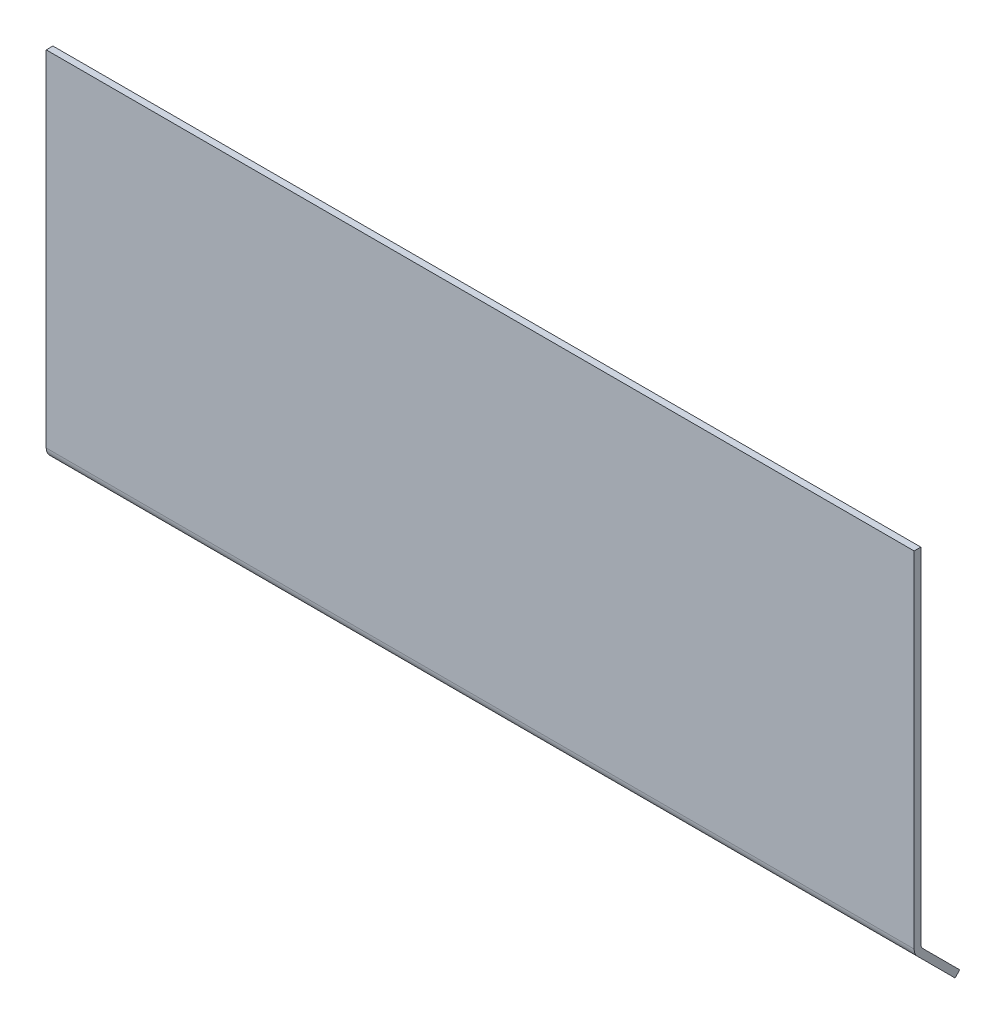
ISO-10303-21;
HEADER;
FILE_DESCRIPTION(('STEP AP214'),'2;1');
FILE_NAME('part.step','',(''),(''),'','','');
FILE_SCHEMA(('AUTOMOTIVE_DESIGN { 1 0 10303 214 1 1 1 1 }'));
ENDSEC;
DATA;
#1=APPLICATION_CONTEXT('core data for automotive mechanical design processes');
#2=APPLICATION_PROTOCOL_DEFINITION('international standard','automotive_design',2000,#1);
#3=PRODUCT_CONTEXT('',#1,'mechanical');
#4=PRODUCT('Part','Part','',(#3));
#5=PRODUCT_RELATED_PRODUCT_CATEGORY('part','',(#4));
#6=PRODUCT_DEFINITION_FORMATION('','',#4);
#7=PRODUCT_DEFINITION_CONTEXT('part definition',#1,'design');
#8=PRODUCT_DEFINITION('design','',#6,#7);
#9=PRODUCT_DEFINITION_SHAPE('','',#8);
#10=(LENGTH_UNIT() NAMED_UNIT(*) SI_UNIT(.MILLI.,.METRE.));
#11=(NAMED_UNIT(*) PLANE_ANGLE_UNIT() SI_UNIT($,.RADIAN.));
#12=(NAMED_UNIT(*) SI_UNIT($,.STERADIAN.) SOLID_ANGLE_UNIT());
#13=UNCERTAINTY_MEASURE_WITH_UNIT(LENGTH_MEASURE(1.E-05),#10,'distance_accuracy_value','');
#14=(GEOMETRIC_REPRESENTATION_CONTEXT(3) GLOBAL_UNCERTAINTY_ASSIGNED_CONTEXT((#13)) GLOBAL_UNIT_ASSIGNED_CONTEXT((#10,
#11,#12)) REPRESENTATION_CONTEXT('',''));
#15=CARTESIAN_POINT('',(0.,0.,0.));
#16=DIRECTION('',(0.,0.,1.));
#17=DIRECTION('',(1.,0.,0.));
#18=AXIS2_PLACEMENT_3D('',#15,#16,#17);
#19=CARTESIAN_POINT('',(360.,-143.211474761492,-110.4));
#20=DIRECTION('',(-1.,0.,0.));
#21=DIRECTION('',(0.,0.,1.));
#22=AXIS2_PLACEMENT_3D('',#19,#20,#21);
#23=PLANE('',#22);
#24=DIRECTION('',(0.,-1.,0.));
#25=VECTOR('',#24,1.);
#26=CARTESIAN_POINT('',(360.,-143.211474761492,-107.4));
#27=LINE('',#26,#25);
#28=CARTESIAN_POINT('',(360.,-143.211474761492,-107.4));
#29=VERTEX_POINT('',#28);
#30=CARTESIAN_POINT('',(360.,-298.140713314432,-107.4));
#31=VERTEX_POINT('',#30);
#32=EDGE_CURVE('E137',#29,#31,#27,.T.);
#33=ORIENTED_EDGE('',*,*,#32,.T.);
#34=CARTESIAN_POINT('',(360.,-298.140713314432,-112.4));
#35=DIRECTION('',(-1.,0.,0.));
#36=DIRECTION('',(0.,0.,1.));
#37=AXIS2_PLACEMENT_3D('',#34,#35,#36);
#38=CIRCLE('',#37,5.);
#39=CARTESIAN_POINT('',(360.,-301.676247220365,-108.864466094067));
#40=VERTEX_POINT('',#39);
#41=EDGE_CURVE('E176',#31,#40,#38,.F.);
#42=ORIENTED_EDGE('',*,*,#41,.T.);
#43=DIRECTION('',(0.,-0.707106781186552,-0.707106781186543));
#44=VECTOR('',#43,1.);
#45=CARTESIAN_POINT('',(360.,-300.211781126298,-107.4));
#46=LINE('',#45,#44);
#47=CARTESIAN_POINT('',(360.,-318.593187218806,-125.781406092508));
#48=VERTEX_POINT('',#47);
#49=EDGE_CURVE('E138',#40,#48,#46,.T.);
#50=ORIENTED_EDGE('',*,*,#49,.T.);
#51=DIRECTION('',(0.,0.707106781186538,-0.707106781186557));
#52=VECTOR('',#51,1.);
#53=CARTESIAN_POINT('',(360.,-318.593187218806,-125.781406092508));
#54=LINE('',#53,#52);
#55=CARTESIAN_POINT('',(360.,-316.471866875247,-127.902726436068));
#56=VERTEX_POINT('',#55);
#57=EDGE_CURVE('E133',#48,#56,#54,.T.);
#58=ORIENTED_EDGE('',*,*,#57,.T.);
#59=DIRECTION('',(0.,0.707106781186551,0.707106781186544));
#60=VECTOR('',#59,1.);
#61=CARTESIAN_POINT('',(360.,-316.471866875247,-127.902726436068));
#62=LINE('',#61,#60);
#63=CARTESIAN_POINT('',(360.,-299.847820095619,-111.27867965644));
#64=VERTEX_POINT('',#63);
#65=EDGE_CURVE('E116',#56,#64,#62,.T.);
#66=ORIENTED_EDGE('',*,*,#65,.T.);
#67=CARTESIAN_POINT('',(360.,-297.726499752059,-113.4));
#68=DIRECTION('',(-1.,0.,0.));
#69=DIRECTION('',(0.,0.,1.));
#70=AXIS2_PLACEMENT_3D('',#67,#68,#69);
#71=CIRCLE('',#70,3.);
#72=CARTESIAN_POINT('',(360.,-297.726499752059,-110.4));
#73=VERTEX_POINT('',#72);
#74=EDGE_CURVE('E11',#64,#73,#71,.T.);
#75=ORIENTED_EDGE('',*,*,#74,.T.);
#76=DIRECTION('',(0.,-1.,0.));
#77=VECTOR('',#76,1.);
#78=CARTESIAN_POINT('',(360.,-143.211474761492,-110.4));
#79=LINE('',#78,#77);
#80=CARTESIAN_POINT('',(360.,-143.211474761492,-110.4));
#81=VERTEX_POINT('',#80);
#82=EDGE_CURVE('E139',#81,#73,#79,.T.);
#83=ORIENTED_EDGE('',*,*,#82,.F.);
#84=DIRECTION('',(0.,0.,1.));
#85=VECTOR('',#84,1.);
#86=CARTESIAN_POINT('',(360.,-143.211474761492,-110.4));
#87=LINE('',#86,#85);
#88=EDGE_CURVE('E150',#81,#29,#87,.T.);
#89=ORIENTED_EDGE('',*,*,#88,.T.);
#90=EDGE_LOOP('',(#33,#42,#50,#58,#66,#75,#83,#89));
#91=FACE_BOUND('',#90,.T.);
#92=ADVANCED_FACE('F41',(#91),#23,.F.);
#93=CARTESIAN_POINT('',(-30.,-143.211474761492,-110.4));
#94=DIRECTION('',(1.,0.,0.));
#95=DIRECTION('',(0.,1.,0.));
#96=AXIS2_PLACEMENT_3D('',#93,#94,#95);
#97=PLANE('',#96);
#98=DIRECTION('',(0.,0.707106781186552,0.707106781186543));
#99=VECTOR('',#98,1.);
#100=CARTESIAN_POINT('',(-30.,-300.211781126298,-107.4));
#101=LINE('',#100,#99);
#102=CARTESIAN_POINT('',(-30.,-318.593187218806,-125.781406092508));
#103=VERTEX_POINT('',#102);
#104=CARTESIAN_POINT('',(-30.,-301.676247220365,-108.864466094067));
#105=VERTEX_POINT('',#104);
#106=EDGE_CURVE('E121',#103,#105,#101,.T.);
#107=ORIENTED_EDGE('',*,*,#106,.T.);
#108=CARTESIAN_POINT('',(-30.,-298.140713314432,-112.4));
#109=DIRECTION('',(1.,0.,0.));
#110=DIRECTION('',(0.,1.,0.));
#111=AXIS2_PLACEMENT_3D('',#108,#109,#110);
#112=CIRCLE('',#111,5.);
#113=CARTESIAN_POINT('',(-30.,-298.140713314432,-107.4));
#114=VERTEX_POINT('',#113);
#115=EDGE_CURVE('E170',#105,#114,#112,.F.);
#116=ORIENTED_EDGE('',*,*,#115,.T.);
#117=DIRECTION('',(0.,1.,0.));
#118=VECTOR('',#117,1.);
#119=CARTESIAN_POINT('',(-30.,-143.211474761492,-107.4));
#120=LINE('',#119,#118);
#121=CARTESIAN_POINT('',(-30.,-143.211474761492,-107.4));
#122=VERTEX_POINT('',#121);
#123=EDGE_CURVE('E154',#114,#122,#120,.T.);
#124=ORIENTED_EDGE('',*,*,#123,.T.);
#125=DIRECTION('',(0.,0.,1.));
#126=VECTOR('',#125,1.);
#127=CARTESIAN_POINT('',(-30.,-143.211474761492,-110.4));
#128=LINE('',#127,#126);
#129=CARTESIAN_POINT('',(-30.,-143.211474761492,-110.4));
#130=VERTEX_POINT('',#129);
#131=EDGE_CURVE('E162',#130,#122,#128,.T.);
#132=ORIENTED_EDGE('',*,*,#131,.F.);
#133=DIRECTION('',(0.,1.,0.));
#134=VECTOR('',#133,1.);
#135=CARTESIAN_POINT('',(-30.,-143.211474761492,-110.4));
#136=LINE('',#135,#134);
#137=CARTESIAN_POINT('',(-30.,-297.726499752059,-110.4));
#138=VERTEX_POINT('',#137);
#139=EDGE_CURVE('E143',#138,#130,#136,.T.);
#140=ORIENTED_EDGE('',*,*,#139,.F.);
#141=CARTESIAN_POINT('',(-30.,-297.726499752059,-113.4));
#142=DIRECTION('',(1.,0.,0.));
#143=DIRECTION('',(0.,1.,0.));
#144=AXIS2_PLACEMENT_3D('',#141,#142,#143);
#145=CIRCLE('',#144,3.);
#146=CARTESIAN_POINT('',(-30.,-299.847820095619,-111.27867965644));
#147=VERTEX_POINT('',#146);
#148=EDGE_CURVE('E50',#138,#147,#145,.T.);
#149=ORIENTED_EDGE('',*,*,#148,.T.);
#150=DIRECTION('',(0.,-0.707106781186551,-0.707106781186544));
#151=VECTOR('',#150,1.);
#152=CARTESIAN_POINT('',(-30.,-316.471866875247,-127.902726436068));
#153=LINE('',#152,#151);
#154=CARTESIAN_POINT('',(-30.,-316.471866875247,-127.902726436068));
#155=VERTEX_POINT('',#154);
#156=EDGE_CURVE('E104',#147,#155,#153,.T.);
#157=ORIENTED_EDGE('',*,*,#156,.T.);
#158=DIRECTION('',(0.,-0.707106781186538,0.707106781186557));
#159=VECTOR('',#158,1.);
#160=CARTESIAN_POINT('',(-30.,-318.593187218806,-125.781406092508));
#161=LINE('',#160,#159);
#162=EDGE_CURVE('E109',#155,#103,#161,.T.);
#163=ORIENTED_EDGE('',*,*,#162,.T.);
#164=EDGE_LOOP('',(#107,#116,#124,#132,#140,#149,#157,#163));
#165=FACE_BOUND('',#164,.T.);
#166=ADVANCED_FACE('F107',(#165),#97,.F.);
#167=CARTESIAN_POINT('',(360.,-143.211474761492,-110.4));
#168=DIRECTION('',(0.,-1.,0.));
#169=DIRECTION('',(0.,0.,-1.));
#170=AXIS2_PLACEMENT_3D('',#167,#168,#169);
#171=PLANE('',#170);
#172=DIRECTION('',(1.,0.,0.));
#173=VECTOR('',#172,1.);
#174=CARTESIAN_POINT('',(360.,-143.211474761492,-107.4));
#175=LINE('',#174,#173);
#176=EDGE_CURVE('E144',#122,#29,#175,.T.);
#177=ORIENTED_EDGE('',*,*,#176,.T.);
#178=ORIENTED_EDGE('',*,*,#88,.F.);
#179=DIRECTION('',(1.,0.,0.));
#180=VECTOR('',#179,1.);
#181=CARTESIAN_POINT('',(360.,-143.211474761492,-110.4));
#182=LINE('',#181,#180);
#183=EDGE_CURVE('E147',#130,#81,#182,.T.);
#184=ORIENTED_EDGE('',*,*,#183,.F.);
#185=ORIENTED_EDGE('',*,*,#131,.T.);
#186=EDGE_LOOP('',(#177,#178,#184,#185));
#187=FACE_BOUND('',#186,.T.);
#188=ADVANCED_FACE('F230',(#187),#171,.F.);
#189=CARTESIAN_POINT('',(0.,0.,-110.4));
#190=DIRECTION('',(0.,0.,-1.));
#191=DIRECTION('',(0.,1.,0.));
#192=AXIS2_PLACEMENT_3D('',#189,#190,#191);
#193=PLANE('',#192);
#194=ORIENTED_EDGE('',*,*,#82,.T.);
#195=DIRECTION('',(-1.,0.,0.));
#196=VECTOR('',#195,1.);
#197=CARTESIAN_POINT('',(-30.,-297.726499752059,-110.4));
#198=LINE('',#197,#196);
#199=EDGE_CURVE('E179',#73,#138,#198,.T.);
#200=ORIENTED_EDGE('',*,*,#199,.T.);
#201=ORIENTED_EDGE('',*,*,#139,.T.);
#202=ORIENTED_EDGE('',*,*,#183,.T.);
#203=EDGE_LOOP('',(#194,#200,#201,#202));
#204=FACE_BOUND('',#203,.T.);
#205=ADVANCED_FACE('F232',(#204),#193,.T.);
#206=CARTESIAN_POINT('',(0.,0.,-107.4));
#207=DIRECTION('',(0.,0.,-1.));
#208=DIRECTION('',(0.,1.,0.));
#209=AXIS2_PLACEMENT_3D('',#206,#207,#208);
#210=PLANE('',#209);
#211=ORIENTED_EDGE('',*,*,#123,.F.);
#212=DIRECTION('',(-1.,0.,0.));
#213=VECTOR('',#212,1.);
#214=CARTESIAN_POINT('',(360.,-298.140713314432,-107.4));
#215=LINE('',#214,#213);
#216=EDGE_CURVE('E173',#114,#31,#215,.F.);
#217=ORIENTED_EDGE('',*,*,#216,.T.);
#218=ORIENTED_EDGE('',*,*,#32,.F.);
#219=ORIENTED_EDGE('',*,*,#176,.F.);
#220=EDGE_LOOP('',(#211,#217,#218,#219));
#221=FACE_BOUND('',#220,.T.);
#222=ADVANCED_FACE('F222',(#221),#210,.F.);
#223=CARTESIAN_POINT('',(388.380715341958,-300.211781126298,-107.4));
#224=DIRECTION('',(0.,-0.707106781186543,0.707106781186552));
#225=DIRECTION('',(0.,-0.707106781186552,-0.707106781186543));
#226=AXIS2_PLACEMENT_3D('',#223,#224,#225);
#227=PLANE('',#226);
#228=ORIENTED_EDGE('',*,*,#49,.F.);
#229=DIRECTION('',(-1.,0.,0.));
#230=VECTOR('',#229,1.);
#231=CARTESIAN_POINT('',(-30.,-301.676247220365,-108.864466094067));
#232=LINE('',#231,#230);
#233=EDGE_CURVE('E166',#40,#105,#232,.T.);
#234=ORIENTED_EDGE('',*,*,#233,.T.);
#235=ORIENTED_EDGE('',*,*,#106,.F.);
#236=DIRECTION('',(-1.,0.,0.));
#237=VECTOR('',#236,1.);
#238=CARTESIAN_POINT('',(388.380715341958,-318.593187218806,-125.781406092508));
#239=LINE('',#238,#237);
#240=EDGE_CURVE('E120',#48,#103,#239,.T.);
#241=ORIENTED_EDGE('',*,*,#240,.F.);
#242=EDGE_LOOP('',(#228,#234,#235,#241));
#243=FACE_BOUND('',#242,.T.);
#244=ADVANCED_FACE('F214',(#243),#227,.T.);
#245=CARTESIAN_POINT('',(388.380715341958,-318.593187218806,-125.781406092508));
#246=DIRECTION('',(0.,-0.707106781186557,-0.707106781186538));
#247=DIRECTION('',(0.,0.707106781186538,-0.707106781186557));
#248=AXIS2_PLACEMENT_3D('',#245,#246,#247);
#249=PLANE('',#248);
#250=ORIENTED_EDGE('',*,*,#57,.F.);
#251=ORIENTED_EDGE('',*,*,#240,.T.);
#252=ORIENTED_EDGE('',*,*,#162,.F.);
#253=DIRECTION('',(-1.,0.,0.));
#254=VECTOR('',#253,1.);
#255=CARTESIAN_POINT('',(388.380715341958,-316.471866875247,-127.902726436068));
#256=LINE('',#255,#254);
#257=EDGE_CURVE('E114',#56,#155,#256,.T.);
#258=ORIENTED_EDGE('',*,*,#257,.F.);
#259=EDGE_LOOP('',(#250,#251,#252,#258));
#260=FACE_BOUND('',#259,.T.);
#261=ADVANCED_FACE('F123',(#260),#249,.T.);
#262=CARTESIAN_POINT('',(388.380715341958,-316.471866875247,-127.902726436068));
#263=DIRECTION('',(0.,0.707106781186544,-0.707106781186551));
#264=DIRECTION('',(0.,0.707106781186551,0.707106781186544));
#265=AXIS2_PLACEMENT_3D('',#262,#263,#264);
#266=PLANE('',#265);
#267=ORIENTED_EDGE('',*,*,#156,.F.);
#268=DIRECTION('',(-1.,0.,0.));
#269=VECTOR('',#268,1.);
#270=CARTESIAN_POINT('',(360.,-299.847820095619,-111.27867965644));
#271=LINE('',#270,#269);
#272=EDGE_CURVE('E63',#147,#64,#271,.F.);
#273=ORIENTED_EDGE('',*,*,#272,.T.);
#274=ORIENTED_EDGE('',*,*,#65,.F.);
#275=ORIENTED_EDGE('',*,*,#257,.T.);
#276=EDGE_LOOP('',(#267,#273,#274,#275));
#277=FACE_BOUND('',#276,.T.);
#278=ADVANCED_FACE('F115',(#277),#266,.T.);
#279=CARTESIAN_POINT('',(388.380715341958,-298.140713314432,-112.4));
#280=DIRECTION('',(1.,0.,0.));
#281=DIRECTION('',(0.,1.,0.));
#282=AXIS2_PLACEMENT_3D('',#279,#280,#281);
#283=CYLINDRICAL_SURFACE('',#282,5.);
#284=ORIENTED_EDGE('',*,*,#41,.F.);
#285=ORIENTED_EDGE('',*,*,#216,.F.);
#286=ORIENTED_EDGE('',*,*,#115,.F.);
#287=ORIENTED_EDGE('',*,*,#233,.F.);
#288=EDGE_LOOP('',(#284,#285,#286,#287));
#289=FACE_BOUND('',#288,.T.);
#290=ADVANCED_FACE('F225',(#289),#283,.T.);
#291=CARTESIAN_POINT('',(0.,-297.726499752059,-113.4));
#292=DIRECTION('',(1.,0.,0.));
#293=DIRECTION('',(0.,1.,0.));
#294=AXIS2_PLACEMENT_3D('',#291,#292,#293);
#295=CYLINDRICAL_SURFACE('',#294,3.);
#296=ORIENTED_EDGE('',*,*,#74,.F.);
#297=ORIENTED_EDGE('',*,*,#272,.F.);
#298=ORIENTED_EDGE('',*,*,#148,.F.);
#299=ORIENTED_EDGE('',*,*,#199,.F.);
#300=EDGE_LOOP('',(#296,#297,#298,#299));
#301=FACE_BOUND('',#300,.T.);
#302=ADVANCED_FACE('F43',(#301),#295,.F.);
#303=CLOSED_SHELL('',(#92,#166,#188,#205,#222,#244,#261,#278,#290,#302));
#304=MANIFOLD_SOLID_BREP('B2',#303);
#305=ADVANCED_BREP_SHAPE_REPRESENTATION('',(#18,#304),#14);
#306=SHAPE_DEFINITION_REPRESENTATION(#9,#305);
ENDSEC;
END-ISO-10303-21;
